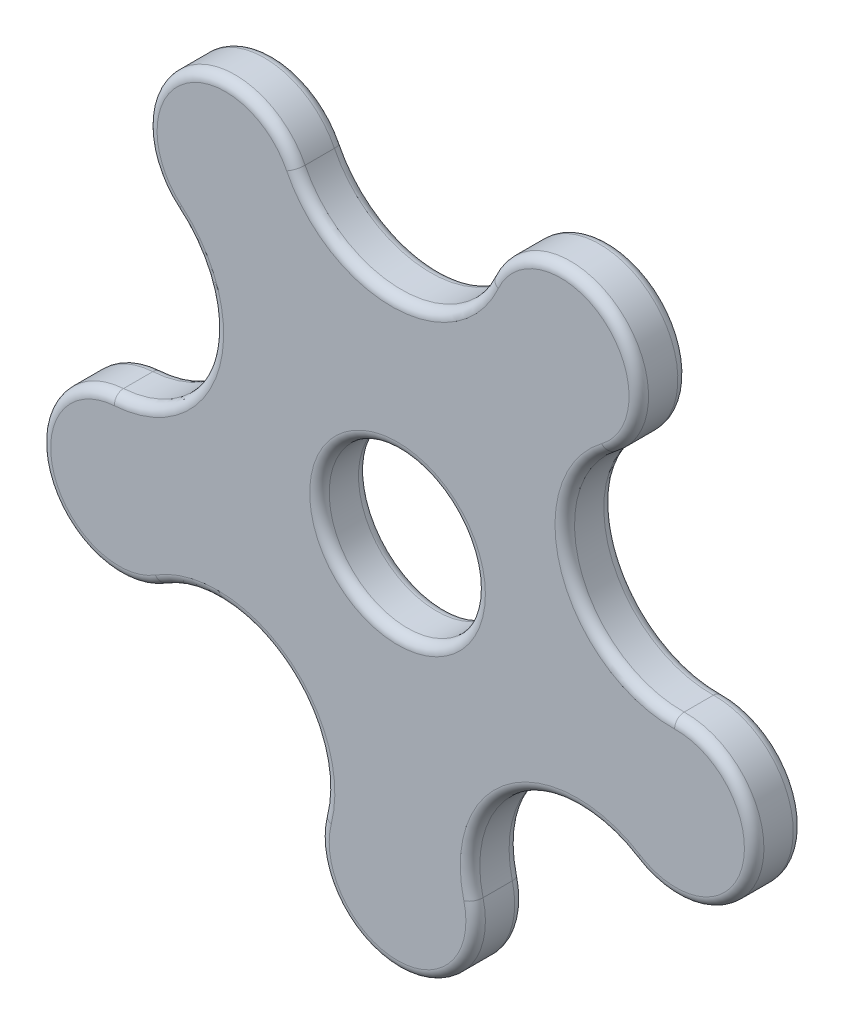
ISO-10303-21;
HEADER;
FILE_DESCRIPTION(('STEP AP214'),'2;1');
FILE_NAME('part.step','',(''),(''),'','','');
FILE_SCHEMA(('AUTOMOTIVE_DESIGN { 1 0 10303 214 1 1 1 1 }'));
ENDSEC;
DATA;
#1=APPLICATION_CONTEXT('core data for automotive mechanical design processes');
#2=APPLICATION_PROTOCOL_DEFINITION('international standard','automotive_design',2000,#1);
#3=PRODUCT_CONTEXT('',#1,'mechanical');
#4=PRODUCT('Part','Part','',(#3));
#5=PRODUCT_RELATED_PRODUCT_CATEGORY('part','',(#4));
#6=PRODUCT_DEFINITION_FORMATION('','',#4);
#7=PRODUCT_DEFINITION_CONTEXT('part definition',#1,'design');
#8=PRODUCT_DEFINITION('design','',#6,#7);
#9=PRODUCT_DEFINITION_SHAPE('','',#8);
#10=(LENGTH_UNIT() NAMED_UNIT(*) SI_UNIT(.MILLI.,.METRE.));
#11=(NAMED_UNIT(*) PLANE_ANGLE_UNIT() SI_UNIT($,.RADIAN.));
#12=(NAMED_UNIT(*) SI_UNIT($,.STERADIAN.) SOLID_ANGLE_UNIT());
#13=UNCERTAINTY_MEASURE_WITH_UNIT(LENGTH_MEASURE(1.E-05),#10,'distance_accuracy_value','');
#14=(GEOMETRIC_REPRESENTATION_CONTEXT(3) GLOBAL_UNCERTAINTY_ASSIGNED_CONTEXT((#13)) GLOBAL_UNIT_ASSIGNED_CONTEXT((#10,
#11,#12)) REPRESENTATION_CONTEXT('',''));
#15=CARTESIAN_POINT('',(0.,0.,0.));
#16=DIRECTION('',(0.,0.,1.));
#17=DIRECTION('',(1.,0.,0.));
#18=AXIS2_PLACEMENT_3D('',#15,#16,#17);
#19=CARTESIAN_POINT('',(8.04949047656189,28.8142522671485,5.));
#20=DIRECTION('',(0.,0.,1.));
#21=DIRECTION('',(1.,0.,0.));
#22=AXIS2_PLACEMENT_3D('',#19,#20,#21);
#23=PLANE('',#22);
#24=CARTESIAN_POINT('',(0.,0.,5.));
#25=DIRECTION('',(0.,0.,1.));
#26=DIRECTION('',(1.,0.,0.));
#27=AXIS2_PLACEMENT_3D('',#24,#25,#26);
#28=CIRCLE('',#27,9.);
#29=CARTESIAN_POINT('',(9.,0.,5.));
#30=VERTEX_POINT('',#29);
#31=EDGE_CURVE('E381',#30,#30,#28,.F.);
#32=ORIENTED_EDGE('',*,*,#31,.T.);
#33=EDGE_LOOP('',(#32));
#34=FACE_BOUND('',#33,.T.);
#35=CARTESIAN_POINT('',(0.,-30.,5.));
#36=DIRECTION('',(0.,0.,1.));
#37=DIRECTION('',(1.,0.,0.));
#38=AXIS2_PLACEMENT_3D('',#35,#36,#37);
#39=CIRCLE('',#38,7.);
#40=CARTESIAN_POINT('',(-6.78797825855479,-28.2902189726788,5.));
#41=VERTEX_POINT('',#40);
#42=CARTESIAN_POINT('',(6.7879782585548,-28.2902189726789,5.));
#43=VERTEX_POINT('',#42);
#44=EDGE_CURVE('E209',#41,#43,#39,.T.);
#45=ORIENTED_EDGE('',*,*,#44,.T.);
#46=CARTESIAN_POINT('',(18.4245124160773,-25.3591657829855,5.));
#47=DIRECTION('',(0.,0.,1.));
#48=DIRECTION('',(1.,0.,0.));
#49=AXIS2_PLACEMENT_3D('',#46,#47,#48);
#50=CIRCLE('',#49,12.);
#51=CARTESIAN_POINT('',(24.8079964620419,-15.1979093924147,5.));
#52=VERTEX_POINT('',#51);
#53=EDGE_CURVE('E188',#43,#52,#50,.F.);
#54=ORIENTED_EDGE('',*,*,#53,.T.);
#55=CARTESIAN_POINT('',(28.5316954888546,-9.27050983124834,5.));
#56=DIRECTION('',(0.,0.,1.));
#57=DIRECTION('',(1.,0.,0.));
#58=AXIS2_PLACEMENT_3D('',#55,#56,#57);
#59=CIRCLE('',#58,7.00000000000007);
#60=CARTESIAN_POINT('',(28.3825142597468,-2.27209965743866,5.));
#61=VERTEX_POINT('',#60);
#62=EDGE_CURVE('E198',#52,#61,#59,.T.);
#63=ORIENTED_EDGE('',*,*,#62,.T.);
#64=CARTESIAN_POINT('',(28.1267750098477,9.72517492623497,5.));
#65=DIRECTION('',(0.,0.,1.));
#66=DIRECTION('',(1.,0.,0.));
#67=AXIS2_PLACEMENT_3D('',#64,#65,#66);
#68=CIRCLE('',#67,12.);
#69=CARTESIAN_POINT('',(20.9174216102417,19.3181527516857,5.));
#70=VERTEX_POINT('',#69);
#71=EDGE_CURVE('E205',#61,#70,#68,.F.);
#72=ORIENTED_EDGE('',*,*,#71,.T.);
#73=CARTESIAN_POINT('',(16.7119654604715,24.9140564831986,5.));
#74=DIRECTION('',(0.,0.,1.));
#75=DIRECTION('',(1.,0.,0.));
#76=AXIS2_PLACEMENT_3D('',#73,#74,#75);
#77=CIRCLE('',#76,7.);
#78=CARTESIAN_POINT('',(10.3290891565381,27.7878849555827,5.));
#79=VERTEX_POINT('',#78);
#80=EDGE_CURVE('E575',#70,#79,#77,.T.);
#81=ORIENTED_EDGE('',*,*,#80,.T.);
#82=CARTESIAN_POINT('',(-0.612984507347689,32.7144480510984,5.));
#83=DIRECTION('',(0.,0.,1.));
#84=DIRECTION('',(1.,0.,0.));
#85=AXIS2_PLACEMENT_3D('',#82,#83,#84);
#86=CIRCLE('',#85,12.);
#87=CARTESIAN_POINT('',(-11.3628201250907,27.3814344385616,5.));
#88=VERTEX_POINT('',#87);
#89=EDGE_CURVE('E578',#79,#88,#86,.F.);
#90=ORIENTED_EDGE('',*,*,#89,.T.);
#91=CARTESIAN_POINT('',(-17.6335575687742,24.2705098312484,5.));
#92=DIRECTION('',(0.,0.,1.));
#93=DIRECTION('',(1.,0.,0.));
#94=AXIS2_PLACEMENT_3D('',#91,#92,#93);
#95=CIRCLE('',#94,7.);
#96=CARTESIAN_POINT('',(-22.1201632648839,18.8973944102253,5.));
#97=VERTEX_POINT('',#96);
#98=EDGE_CURVE('E581',#88,#97,#95,.T.);
#99=ORIENTED_EDGE('',*,*,#98,.T.);
#100=CARTESIAN_POINT('',(-29.8114873153576,9.68633940275719,5.));
#101=DIRECTION('',(0.,0.,1.));
#102=DIRECTION('',(1.,0.,0.));
#103=AXIS2_PLACEMENT_3D('',#100,#101,#102);
#104=CIRCLE('',#103,12.);
#105=CARTESIAN_POINT('',(-29.0031977407242,-2.28640748187789,5.));
#106=VERTEX_POINT('',#105);
#107=EDGE_CURVE('E584',#97,#106,#104,.F.);
#108=ORIENTED_EDGE('',*,*,#107,.T.);
#109=CARTESIAN_POINT('',(-28.5316954888546,-9.27050983124835,5.));
#110=DIRECTION('',(0.,0.,1.));
#111=DIRECTION('',(1.,0.,0.));
#112=AXIS2_PLACEMENT_3D('',#109,#110,#111);
#113=CIRCLE('',#112,7.);
#114=CARTESIAN_POINT('',(-24.8079964620419,-15.1979093924146,5.));
#115=VERTEX_POINT('',#114);
#116=EDGE_CURVE('E587',#106,#115,#113,.T.);
#117=ORIENTED_EDGE('',*,*,#116,.T.);
#118=CARTESIAN_POINT('',(-18.4245124160773,-25.3591657829854,5.));
#119=DIRECTION('',(0.,0.,1.));
#120=DIRECTION('',(1.,0.,0.));
#121=AXIS2_PLACEMENT_3D('',#118,#119,#120);
#122=CIRCLE('',#121,12.);
#123=EDGE_CURVE('E217',#115,#41,#122,.F.);
#124=ORIENTED_EDGE('',*,*,#123,.T.);
#125=EDGE_LOOP('',(#45,#54,#63,#72,#81,#90,#99,#108,#117,#124));
#126=FACE_BOUND('',#125,.T.);
#127=ADVANCED_FACE('F42',(#34,#126),#23,.T.);
#128=CARTESIAN_POINT('',(8.04949047656189,28.8142522671485,0.));
#129=DIRECTION('',(0.,0.,1.));
#130=DIRECTION('',(1.,0.,0.));
#131=AXIS2_PLACEMENT_3D('',#128,#129,#130);
#132=PLANE('',#131);
#133=CARTESIAN_POINT('',(0.,0.,0.));
#134=DIRECTION('',(0.,0.,1.));
#135=DIRECTION('',(1.,0.,0.));
#136=AXIS2_PLACEMENT_3D('',#133,#134,#135);
#137=CIRCLE('',#136,9.);
#138=CARTESIAN_POINT('',(9.,0.,0.));
#139=VERTEX_POINT('',#138);
#140=EDGE_CURVE('E51',#139,#139,#137,.T.);
#141=ORIENTED_EDGE('',*,*,#140,.T.);
#142=EDGE_LOOP('',(#141));
#143=FACE_BOUND('',#142,.T.);
#144=CARTESIAN_POINT('',(28.1267750098477,9.72517492623497,0.));
#145=DIRECTION('',(0.,0.,1.));
#146=DIRECTION('',(1.,0.,0.));
#147=AXIS2_PLACEMENT_3D('',#144,#145,#146);
#148=CIRCLE('',#147,12.);
#149=CARTESIAN_POINT('',(20.9174216102417,19.3181527516857,0.));
#150=VERTEX_POINT('',#149);
#151=CARTESIAN_POINT('',(28.3825142597468,-2.27209965743865,0.));
#152=VERTEX_POINT('',#151);
#153=EDGE_CURVE('E284',#150,#152,#148,.T.);
#154=ORIENTED_EDGE('',*,*,#153,.T.);
#155=CARTESIAN_POINT('',(28.5316954888546,-9.27050983124834,0.));
#156=DIRECTION('',(0.,0.,1.));
#157=DIRECTION('',(1.,0.,0.));
#158=AXIS2_PLACEMENT_3D('',#155,#156,#157);
#159=CIRCLE('',#158,7.00000000000007);
#160=CARTESIAN_POINT('',(24.8079964620419,-15.1979093924147,0.));
#161=VERTEX_POINT('',#160);
#162=EDGE_CURVE('E311',#152,#161,#159,.F.);
#163=ORIENTED_EDGE('',*,*,#162,.T.);
#164=CARTESIAN_POINT('',(18.4245124160773,-25.3591657829855,0.));
#165=DIRECTION('',(0.,0.,1.));
#166=DIRECTION('',(1.,0.,0.));
#167=AXIS2_PLACEMENT_3D('',#164,#165,#166);
#168=CIRCLE('',#167,12.);
#169=CARTESIAN_POINT('',(6.7879782585548,-28.2902189726789,0.));
#170=VERTEX_POINT('',#169);
#171=EDGE_CURVE('E308',#161,#170,#168,.T.);
#172=ORIENTED_EDGE('',*,*,#171,.T.);
#173=CARTESIAN_POINT('',(0.,-30.,0.));
#174=DIRECTION('',(0.,0.,1.));
#175=DIRECTION('',(1.,0.,0.));
#176=AXIS2_PLACEMENT_3D('',#173,#174,#175);
#177=CIRCLE('',#176,7.);
#178=CARTESIAN_POINT('',(-6.78797825855479,-28.2902189726788,0.));
#179=VERTEX_POINT('',#178);
#180=EDGE_CURVE('E305',#170,#179,#177,.F.);
#181=ORIENTED_EDGE('',*,*,#180,.T.);
#182=CARTESIAN_POINT('',(-18.4245124160773,-25.3591657829854,0.));
#183=DIRECTION('',(0.,0.,1.));
#184=DIRECTION('',(1.,0.,0.));
#185=AXIS2_PLACEMENT_3D('',#182,#183,#184);
#186=CIRCLE('',#185,12.);
#187=CARTESIAN_POINT('',(-24.8079964620419,-15.1979093924146,0.));
#188=VERTEX_POINT('',#187);
#189=EDGE_CURVE('E302',#179,#188,#186,.T.);
#190=ORIENTED_EDGE('',*,*,#189,.T.);
#191=CARTESIAN_POINT('',(-28.5316954888546,-9.27050983124835,0.));
#192=DIRECTION('',(0.,0.,1.));
#193=DIRECTION('',(1.,0.,0.));
#194=AXIS2_PLACEMENT_3D('',#191,#192,#193);
#195=CIRCLE('',#194,7.);
#196=CARTESIAN_POINT('',(-29.0031977407242,-2.28640748187789,0.));
#197=VERTEX_POINT('',#196);
#198=EDGE_CURVE('E299',#188,#197,#195,.F.);
#199=ORIENTED_EDGE('',*,*,#198,.T.);
#200=CARTESIAN_POINT('',(-29.8114873153576,9.68633940275719,0.));
#201=DIRECTION('',(0.,0.,1.));
#202=DIRECTION('',(1.,0.,0.));
#203=AXIS2_PLACEMENT_3D('',#200,#201,#202);
#204=CIRCLE('',#203,12.);
#205=CARTESIAN_POINT('',(-22.1201632648839,18.8973944102253,0.));
#206=VERTEX_POINT('',#205);
#207=EDGE_CURVE('E296',#197,#206,#204,.T.);
#208=ORIENTED_EDGE('',*,*,#207,.T.);
#209=CARTESIAN_POINT('',(-17.6335575687742,24.2705098312484,0.));
#210=DIRECTION('',(0.,0.,1.));
#211=DIRECTION('',(1.,0.,0.));
#212=AXIS2_PLACEMENT_3D('',#209,#210,#211);
#213=CIRCLE('',#212,7.);
#214=CARTESIAN_POINT('',(-11.3628201250907,27.3814344385616,0.));
#215=VERTEX_POINT('',#214);
#216=EDGE_CURVE('E293',#206,#215,#213,.F.);
#217=ORIENTED_EDGE('',*,*,#216,.T.);
#218=CARTESIAN_POINT('',(-0.612984507347689,32.7144480510984,0.));
#219=DIRECTION('',(0.,0.,1.));
#220=DIRECTION('',(1.,0.,0.));
#221=AXIS2_PLACEMENT_3D('',#218,#219,#220);
#222=CIRCLE('',#221,12.);
#223=CARTESIAN_POINT('',(10.3290891565381,27.7878849555827,0.));
#224=VERTEX_POINT('',#223);
#225=EDGE_CURVE('E290',#215,#224,#222,.T.);
#226=ORIENTED_EDGE('',*,*,#225,.T.);
#227=CARTESIAN_POINT('',(16.7119654604715,24.9140564831986,0.));
#228=DIRECTION('',(0.,0.,1.));
#229=DIRECTION('',(1.,0.,0.));
#230=AXIS2_PLACEMENT_3D('',#227,#228,#229);
#231=CIRCLE('',#230,7.);
#232=EDGE_CURVE('E287',#224,#150,#231,.F.);
#233=ORIENTED_EDGE('',*,*,#232,.T.);
#234=EDGE_LOOP('',(#154,#163,#172,#181,#190,#199,#208,#217,#226,#233));
#235=FACE_BOUND('',#234,.T.);
#236=ADVANCED_FACE('F388',(#143,#235),#132,.F.);
#237=CARTESIAN_POINT('',(-0.612984507347689,32.7144480510984,5.));
#238=DIRECTION('',(0.,0.,-1.));
#239=DIRECTION('',(-1.,0.,0.));
#240=AXIS2_PLACEMENT_3D('',#237,#238,#239);
#241=CYLINDRICAL_SURFACE('',#240,11.);
#242=DIRECTION('',(0.,0.,-1.));
#243=VECTOR('',#242,1.);
#244=CARTESIAN_POINT('',(9.41724968454762,28.198431880209,5.));
#245=LINE('',#244,#243);
#246=CARTESIAN_POINT('',(9.41724968454762,28.198431880209,4.));
#247=VERTEX_POINT('',#246);
#248=CARTESIAN_POINT('',(9.41724968454762,28.198431880209,1.));
#249=VERTEX_POINT('',#248);
#250=EDGE_CURVE('E280',#247,#249,#245,.T.);
#251=ORIENTED_EDGE('',*,*,#250,.T.);
#252=CARTESIAN_POINT('',(-0.612984507347689,32.7144480510984,1.));
#253=DIRECTION('',(0.,0.,1.));
#254=DIRECTION('',(1.,0.,0.));
#255=AXIS2_PLACEMENT_3D('',#252,#253,#254);
#256=CIRCLE('',#255,11.);
#257=CARTESIAN_POINT('',(-10.4670004902788,27.8258522396063,1.));
#258=VERTEX_POINT('',#257);
#259=EDGE_CURVE('E333',#249,#258,#256,.F.);
#260=ORIENTED_EDGE('',*,*,#259,.T.);
#261=DIRECTION('',(0.,0.,-1.));
#262=VECTOR('',#261,1.);
#263=CARTESIAN_POINT('',(-10.4670004902788,27.8258522396063,5.));
#264=LINE('',#263,#262);
#265=CARTESIAN_POINT('',(-10.4670004902788,27.8258522396063,4.));
#266=VERTEX_POINT('',#265);
#267=EDGE_CURVE('E206',#266,#258,#264,.T.);
#268=ORIENTED_EDGE('',*,*,#267,.F.);
#269=CARTESIAN_POINT('',(-0.612984507347689,32.7144480510984,4.));
#270=DIRECTION('',(0.,0.,1.));
#271=DIRECTION('',(1.,0.,0.));
#272=AXIS2_PLACEMENT_3D('',#269,#270,#271);
#273=CIRCLE('',#272,11.);
#274=EDGE_CURVE('E235',#266,#247,#273,.T.);
#275=ORIENTED_EDGE('',*,*,#274,.T.);
#276=EDGE_LOOP('',(#251,#260,#268,#275));
#277=FACE_BOUND('',#276,.T.);
#278=ADVANCED_FACE('F408',(#277),#241,.F.);
#279=CARTESIAN_POINT('',(-17.6335575687742,24.2705098312484,5.));
#280=DIRECTION('',(0.,0.,-1.));
#281=DIRECTION('',(-1.,0.,0.));
#282=AXIS2_PLACEMENT_3D('',#279,#280,#281);
#283=CYLINDRICAL_SURFACE('',#282,8.);
#284=ORIENTED_EDGE('',*,*,#267,.T.);
#285=CARTESIAN_POINT('',(-17.6335575687742,24.2705098312484,1.));
#286=DIRECTION('',(0.,0.,1.));
#287=DIRECTION('',(1.,0.,0.));
#288=AXIS2_PLACEMENT_3D('',#285,#286,#287);
#289=CIRCLE('',#288,8.);
#290=CARTESIAN_POINT('',(-22.7611069357567,18.1298064929363,1.));
#291=VERTEX_POINT('',#290);
#292=EDGE_CURVE('E330',#258,#291,#289,.T.);
#293=ORIENTED_EDGE('',*,*,#292,.T.);
#294=DIRECTION('',(0.,0.,-1.));
#295=VECTOR('',#294,1.);
#296=CARTESIAN_POINT('',(-22.7611069357567,18.1298064929363,5.));
#297=LINE('',#296,#295);
#298=CARTESIAN_POINT('',(-22.7611069357567,18.1298064929363,4.));
#299=VERTEX_POINT('',#298);
#300=EDGE_CURVE('E566',#299,#291,#297,.T.);
#301=ORIENTED_EDGE('',*,*,#300,.F.);
#302=CARTESIAN_POINT('',(-17.6335575687742,24.2705098312484,4.));
#303=DIRECTION('',(0.,0.,1.));
#304=DIRECTION('',(1.,0.,0.));
#305=AXIS2_PLACEMENT_3D('',#302,#303,#304);
#306=CIRCLE('',#305,8.);
#307=EDGE_CURVE('E232',#299,#266,#306,.F.);
#308=ORIENTED_EDGE('',*,*,#307,.T.);
#309=EDGE_LOOP('',(#284,#293,#301,#308));
#310=FACE_BOUND('',#309,.T.);
#311=ADVANCED_FACE('F442',(#310),#283,.T.);
#312=CARTESIAN_POINT('',(-29.8114873153576,9.68633940275719,5.));
#313=DIRECTION('',(0.,0.,-1.));
#314=DIRECTION('',(-1.,0.,0.));
#315=AXIS2_PLACEMENT_3D('',#312,#313,#314);
#316=CYLINDRICAL_SURFACE('',#315,11.);
#317=ORIENTED_EDGE('',*,*,#300,.T.);
#318=CARTESIAN_POINT('',(-29.8114873153576,9.68633940275719,1.));
#319=DIRECTION('',(0.,0.,1.));
#320=DIRECTION('',(1.,0.,0.));
#321=AXIS2_PLACEMENT_3D('',#318,#319,#320);
#322=CIRCLE('',#321,11.);
#323=CARTESIAN_POINT('',(-29.0705552052769,-1.28867857482496,1.));
#324=VERTEX_POINT('',#323);
#325=EDGE_CURVE('E327',#291,#324,#322,.F.);
#326=ORIENTED_EDGE('',*,*,#325,.T.);
#327=DIRECTION('',(0.,0.,-1.));
#328=VECTOR('',#327,1.);
#329=CARTESIAN_POINT('',(-29.0705552052769,-1.28867857482496,5.));
#330=LINE('',#329,#328);
#331=CARTESIAN_POINT('',(-29.0705552052769,-1.28867857482496,4.));
#332=VERTEX_POINT('',#331);
#333=EDGE_CURVE('E557',#332,#324,#330,.T.);
#334=ORIENTED_EDGE('',*,*,#333,.F.);
#335=CARTESIAN_POINT('',(-29.8114873153576,9.68633940275719,4.));
#336=DIRECTION('',(0.,0.,1.));
#337=DIRECTION('',(1.,0.,0.));
#338=AXIS2_PLACEMENT_3D('',#335,#336,#337);
#339=CIRCLE('',#338,11.);
#340=EDGE_CURVE('E229',#332,#299,#339,.T.);
#341=ORIENTED_EDGE('',*,*,#340,.T.);
#342=EDGE_LOOP('',(#317,#326,#334,#341));
#343=FACE_BOUND('',#342,.T.);
#344=ADVANCED_FACE('F438',(#343),#316,.F.);
#345=CARTESIAN_POINT('',(-28.5316954888546,-9.27050983124835,5.));
#346=DIRECTION('',(0.,0.,-1.));
#347=DIRECTION('',(-1.,0.,0.));
#348=AXIS2_PLACEMENT_3D('',#345,#346,#347);
#349=CYLINDRICAL_SURFACE('',#348,8.);
#350=ORIENTED_EDGE('',*,*,#333,.T.);
#351=CARTESIAN_POINT('',(-28.5316954888546,-9.27050983124835,1.));
#352=DIRECTION('',(0.,0.,1.));
#353=DIRECTION('',(1.,0.,0.));
#354=AXIS2_PLACEMENT_3D('',#351,#352,#353);
#355=CIRCLE('',#354,8.);
#356=CARTESIAN_POINT('',(-24.2760394582115,-16.0446807582955,1.));
#357=VERTEX_POINT('',#356);
#358=EDGE_CURVE('E324',#324,#357,#355,.T.);
#359=ORIENTED_EDGE('',*,*,#358,.T.);
#360=DIRECTION('',(0.,0.,-1.));
#361=VECTOR('',#360,1.);
#362=CARTESIAN_POINT('',(-24.2760394582115,-16.0446807582955,5.));
#363=LINE('',#362,#361);
#364=CARTESIAN_POINT('',(-24.2760394582115,-16.0446807582955,4.));
#365=VERTEX_POINT('',#364);
#366=EDGE_CURVE('E548',#365,#357,#363,.T.);
#367=ORIENTED_EDGE('',*,*,#366,.F.);
#368=CARTESIAN_POINT('',(-28.5316954888546,-9.27050983124835,4.));
#369=DIRECTION('',(0.,0.,1.));
#370=DIRECTION('',(1.,0.,0.));
#371=AXIS2_PLACEMENT_3D('',#368,#369,#370);
#372=CIRCLE('',#371,8.);
#373=EDGE_CURVE('E226',#365,#332,#372,.F.);
#374=ORIENTED_EDGE('',*,*,#373,.T.);
#375=EDGE_LOOP('',(#350,#359,#367,#374));
#376=FACE_BOUND('',#375,.T.);
#377=ADVANCED_FACE('F434',(#376),#349,.T.);
#378=CARTESIAN_POINT('',(-18.4245124160773,-25.3591657829854,5.));
#379=DIRECTION('',(0.,0.,-1.));
#380=DIRECTION('',(-1.,0.,0.));
#381=AXIS2_PLACEMENT_3D('',#378,#379,#380);
#382=CYLINDRICAL_SURFACE('',#381,11.);
#383=ORIENTED_EDGE('',*,*,#366,.T.);
#384=CARTESIAN_POINT('',(-18.4245124160773,-25.3591657829854,1.));
#385=DIRECTION('',(0.,0.,1.));
#386=DIRECTION('',(1.,0.,0.));
#387=AXIS2_PLACEMENT_3D('',#384,#385,#386);
#388=CIRCLE('',#387,11.);
#389=CARTESIAN_POINT('',(-7.75768943834833,-28.0459645402044,1.));
#390=VERTEX_POINT('',#389);
#391=EDGE_CURVE('E321',#357,#390,#388,.F.);
#392=ORIENTED_EDGE('',*,*,#391,.T.);
#393=DIRECTION('',(0.,0.,-1.));
#394=VECTOR('',#393,1.);
#395=CARTESIAN_POINT('',(-7.75768943834833,-28.0459645402044,5.));
#396=LINE('',#395,#394);
#397=CARTESIAN_POINT('',(-7.75768943834833,-28.0459645402044,4.));
#398=VERTEX_POINT('',#397);
#399=EDGE_CURVE('E545',#398,#390,#396,.T.);
#400=ORIENTED_EDGE('',*,*,#399,.F.);
#401=CARTESIAN_POINT('',(-18.4245124160773,-25.3591657829854,4.));
#402=DIRECTION('',(0.,0.,1.));
#403=DIRECTION('',(1.,0.,0.));
#404=AXIS2_PLACEMENT_3D('',#401,#402,#403);
#405=CIRCLE('',#404,11.);
#406=EDGE_CURVE('E223',#398,#365,#405,.T.);
#407=ORIENTED_EDGE('',*,*,#406,.T.);
#408=EDGE_LOOP('',(#383,#392,#400,#407));
#409=FACE_BOUND('',#408,.T.);
#410=ADVANCED_FACE('F430',(#409),#382,.F.);
#411=CARTESIAN_POINT('',(0.,-30.,5.));
#412=DIRECTION('',(0.,0.,-1.));
#413=DIRECTION('',(-1.,0.,0.));
#414=AXIS2_PLACEMENT_3D('',#411,#412,#413);
#415=CYLINDRICAL_SURFACE('',#414,8.);
#416=ORIENTED_EDGE('',*,*,#399,.T.);
#417=CARTESIAN_POINT('',(0.,-30.,1.));
#418=DIRECTION('',(0.,0.,1.));
#419=DIRECTION('',(1.,0.,0.));
#420=AXIS2_PLACEMENT_3D('',#417,#418,#419);
#421=CIRCLE('',#420,8.);
#422=CARTESIAN_POINT('',(7.75768943834835,-28.0459645402044,1.));
#423=VERTEX_POINT('',#422);
#424=EDGE_CURVE('E318',#390,#423,#421,.T.);
#425=ORIENTED_EDGE('',*,*,#424,.T.);
#426=DIRECTION('',(0.,0.,-1.));
#427=VECTOR('',#426,1.);
#428=CARTESIAN_POINT('',(7.75768943834835,-28.0459645402044,5.));
#429=LINE('',#428,#427);
#430=CARTESIAN_POINT('',(7.75768943834835,-28.0459645402044,4.));
#431=VERTEX_POINT('',#430);
#432=EDGE_CURVE('E553',#431,#423,#429,.T.);
#433=ORIENTED_EDGE('',*,*,#432,.F.);
#434=CARTESIAN_POINT('',(0.,-30.,4.));
#435=DIRECTION('',(0.,0.,1.));
#436=DIRECTION('',(1.,0.,0.));
#437=AXIS2_PLACEMENT_3D('',#434,#435,#436);
#438=CIRCLE('',#437,8.);
#439=EDGE_CURVE('E215',#431,#398,#438,.F.);
#440=ORIENTED_EDGE('',*,*,#439,.T.);
#441=EDGE_LOOP('',(#416,#425,#433,#440));
#442=FACE_BOUND('',#441,.T.);
#443=ADVANCED_FACE('F426',(#442),#415,.T.);
#444=CARTESIAN_POINT('',(18.4245124160773,-25.3591657829855,5.));
#445=DIRECTION('',(0.,0.,-1.));
#446=DIRECTION('',(-1.,0.,0.));
#447=AXIS2_PLACEMENT_3D('',#444,#445,#446);
#448=CYLINDRICAL_SURFACE('',#447,11.);
#449=ORIENTED_EDGE('',*,*,#432,.T.);
#450=CARTESIAN_POINT('',(18.4245124160773,-25.3591657829855,1.));
#451=DIRECTION('',(0.,0.,1.));
#452=DIRECTION('',(1.,0.,0.));
#453=AXIS2_PLACEMENT_3D('',#450,#451,#452);
#454=CIRCLE('',#453,11.);
#455=CARTESIAN_POINT('',(24.2760394582115,-16.0446807582956,1.));
#456=VERTEX_POINT('',#455);
#457=EDGE_CURVE('E315',#423,#456,#454,.F.);
#458=ORIENTED_EDGE('',*,*,#457,.T.);
#459=DIRECTION('',(0.,0.,-1.));
#460=VECTOR('',#459,1.);
#461=CARTESIAN_POINT('',(24.2760394582115,-16.0446807582956,5.));
#462=LINE('',#461,#460);
#463=CARTESIAN_POINT('',(24.2760394582115,-16.0446807582956,4.));
#464=VERTEX_POINT('',#463);
#465=EDGE_CURVE('E559',#464,#456,#462,.T.);
#466=ORIENTED_EDGE('',*,*,#465,.F.);
#467=CARTESIAN_POINT('',(18.4245124160773,-25.3591657829855,4.));
#468=DIRECTION('',(0.,0.,1.));
#469=DIRECTION('',(1.,0.,0.));
#470=AXIS2_PLACEMENT_3D('',#467,#468,#469);
#471=CIRCLE('',#470,11.);
#472=EDGE_CURVE('E190',#464,#431,#471,.T.);
#473=ORIENTED_EDGE('',*,*,#472,.T.);
#474=EDGE_LOOP('',(#449,#458,#466,#473));
#475=FACE_BOUND('',#474,.T.);
#476=ADVANCED_FACE('F422',(#475),#448,.F.);
#477=CARTESIAN_POINT('',(28.5316954888546,-9.27050983124834,5.));
#478=DIRECTION('',(0.,0.,-1.));
#479=DIRECTION('',(-1.,0.,0.));
#480=AXIS2_PLACEMENT_3D('',#477,#478,#479);
#481=CYLINDRICAL_SURFACE('',#480,8.00000000000007);
#482=ORIENTED_EDGE('',*,*,#465,.T.);
#483=CARTESIAN_POINT('',(28.5316954888546,-9.27050983124834,1.));
#484=DIRECTION('',(0.,0.,1.));
#485=DIRECTION('',(1.,0.,0.));
#486=AXIS2_PLACEMENT_3D('',#483,#484,#485);
#487=CIRCLE('',#486,8.00000000000007);
#488=CARTESIAN_POINT('',(28.3612026555886,-1.27232677546585,1.));
#489=VERTEX_POINT('',#488);
#490=EDGE_CURVE('E246',#456,#489,#487,.T.);
#491=ORIENTED_EDGE('',*,*,#490,.T.);
#492=DIRECTION('',(0.,0.,-1.));
#493=VECTOR('',#492,1.);
#494=CARTESIAN_POINT('',(28.3612026555886,-1.27232677546585,5.));
#495=LINE('',#494,#493);
#496=CARTESIAN_POINT('',(28.3612026555886,-1.27232677546585,4.));
#497=VERTEX_POINT('',#496);
#498=EDGE_CURVE('E600',#497,#489,#495,.T.);
#499=ORIENTED_EDGE('',*,*,#498,.F.);
#500=CARTESIAN_POINT('',(28.5316954888546,-9.27050983124834,4.));
#501=DIRECTION('',(0.,0.,1.));
#502=DIRECTION('',(1.,0.,0.));
#503=AXIS2_PLACEMENT_3D('',#500,#501,#502);
#504=CIRCLE('',#503,8.00000000000007);
#505=EDGE_CURVE('E244',#497,#464,#504,.F.);
#506=ORIENTED_EDGE('',*,*,#505,.T.);
#507=EDGE_LOOP('',(#482,#491,#499,#506));
#508=FACE_BOUND('',#507,.T.);
#509=ADVANCED_FACE('F419',(#508),#481,.T.);
#510=CARTESIAN_POINT('',(28.1267750098477,9.72517492623497,5.));
#511=DIRECTION('',(0.,0.,-1.));
#512=DIRECTION('',(-1.,0.,0.));
#513=AXIS2_PLACEMENT_3D('',#510,#511,#512);
#514=CYLINDRICAL_SURFACE('',#513,11.);
#515=ORIENTED_EDGE('',*,*,#498,.T.);
#516=CARTESIAN_POINT('',(28.1267750098477,9.72517492623497,1.));
#517=DIRECTION('',(0.,0.,1.));
#518=DIRECTION('',(1.,0.,0.));
#519=AXIS2_PLACEMENT_3D('',#516,#517,#518);
#520=CIRCLE('',#519,11.);
#521=CARTESIAN_POINT('',(21.5182010602089,18.5187379328981,1.));
#522=VERTEX_POINT('',#521);
#523=EDGE_CURVE('E58',#489,#522,#520,.F.);
#524=ORIENTED_EDGE('',*,*,#523,.T.);
#525=DIRECTION('',(0.,0.,-1.));
#526=VECTOR('',#525,1.);
#527=CARTESIAN_POINT('',(21.5182010602089,18.5187379328981,5.));
#528=LINE('',#527,#526);
#529=CARTESIAN_POINT('',(21.5182010602089,18.5187379328981,4.));
#530=VERTEX_POINT('',#529);
#531=EDGE_CURVE('E602',#530,#522,#528,.T.);
#532=ORIENTED_EDGE('',*,*,#531,.F.);
#533=CARTESIAN_POINT('',(28.1267750098477,9.72517492623497,4.));
#534=DIRECTION('',(0.,0.,1.));
#535=DIRECTION('',(1.,0.,0.));
#536=AXIS2_PLACEMENT_3D('',#533,#534,#535);
#537=CIRCLE('',#536,11.);
#538=EDGE_CURVE('E241',#530,#497,#537,.T.);
#539=ORIENTED_EDGE('',*,*,#538,.T.);
#540=EDGE_LOOP('',(#515,#524,#532,#539));
#541=FACE_BOUND('',#540,.T.);
#542=ADVANCED_FACE('F416',(#541),#514,.F.);
#543=CARTESIAN_POINT('',(16.7119654604715,24.9140564831986,5.));
#544=DIRECTION('',(0.,0.,-1.));
#545=DIRECTION('',(-1.,0.,0.));
#546=AXIS2_PLACEMENT_3D('',#543,#544,#545);
#547=CYLINDRICAL_SURFACE('',#546,8.);
#548=ORIENTED_EDGE('',*,*,#531,.T.);
#549=CARTESIAN_POINT('',(16.7119654604715,24.9140564831986,1.));
#550=DIRECTION('',(0.,0.,1.));
#551=DIRECTION('',(1.,0.,0.));
#552=AXIS2_PLACEMENT_3D('',#549,#550,#551);
#553=CIRCLE('',#552,8.);
#554=EDGE_CURVE('E65',#522,#249,#553,.T.);
#555=ORIENTED_EDGE('',*,*,#554,.T.);
#556=ORIENTED_EDGE('',*,*,#250,.F.);
#557=CARTESIAN_POINT('',(16.7119654604715,24.9140564831986,4.));
#558=DIRECTION('',(0.,0.,1.));
#559=DIRECTION('',(1.,0.,0.));
#560=AXIS2_PLACEMENT_3D('',#557,#558,#559);
#561=CIRCLE('',#560,8.);
#562=EDGE_CURVE('E238',#247,#530,#561,.F.);
#563=ORIENTED_EDGE('',*,*,#562,.T.);
#564=EDGE_LOOP('',(#548,#555,#556,#563));
#565=FACE_BOUND('',#564,.T.);
#566=ADVANCED_FACE('F413',(#565),#547,.T.);
#567=CARTESIAN_POINT('',(0.,0.,5.));
#568=DIRECTION('',(0.,0.,-1.));
#569=DIRECTION('',(-1.,0.,0.));
#570=AXIS2_PLACEMENT_3D('',#567,#568,#569);
#571=CYLINDRICAL_SURFACE('',#570,8.);
#572=CARTESIAN_POINT('',(0.,0.,1.));
#573=DIRECTION('',(0.,0.,1.));
#574=DIRECTION('',(1.,0.,0.));
#575=AXIS2_PLACEMENT_3D('',#572,#573,#574);
#576=CIRCLE('',#575,8.);
#577=CARTESIAN_POINT('',(8.,0.,1.));
#578=VERTEX_POINT('',#577);
#579=EDGE_CURVE('E11',#578,#578,#576,.F.);
#580=ORIENTED_EDGE('',*,*,#579,.T.);
#581=EDGE_LOOP('',(#580));
#582=FACE_BOUND('',#581,.T.);
#583=CARTESIAN_POINT('',(0.,0.,4.));
#584=DIRECTION('',(0.,0.,1.));
#585=DIRECTION('',(1.,0.,0.));
#586=AXIS2_PLACEMENT_3D('',#583,#584,#585);
#587=CIRCLE('',#586,8.);
#588=CARTESIAN_POINT('',(8.,0.,4.));
#589=VERTEX_POINT('',#588);
#590=EDGE_CURVE('E340',#589,#589,#587,.T.);
#591=ORIENTED_EDGE('',*,*,#590,.T.);
#592=EDGE_LOOP('',(#591));
#593=FACE_BOUND('',#592,.T.);
#594=ADVANCED_FACE('F411',(#582,#593),#571,.F.);
#595=CARTESIAN_POINT('',(-17.6335575687742,24.2705098312484,4.));
#596=DIRECTION('',(0.,0.,1.));
#597=DIRECTION('',(1.,0.,0.));
#598=AXIS2_PLACEMENT_3D('',#595,#596,#597);
#599=TOROIDAL_SURFACE('',#598,7.,1.);
#600=CARTESIAN_POINT('',(-11.3628201250907,27.3814344385616,4.));
#601=DIRECTION('',(0.444417801044733,-0.895819634811921,0.));
#602=DIRECTION('',(0.895819634811921,0.444417801044733,0.));
#603=AXIS2_PLACEMENT_3D('',#600,#601,#602);
#604=CIRCLE('',#603,1.);
#605=EDGE_CURVE('E272',#266,#88,#604,.T.);
#606=ORIENTED_EDGE('',*,*,#605,.F.);
#607=ORIENTED_EDGE('',*,*,#307,.F.);
#608=CARTESIAN_POINT('',(-22.1201632648839,18.8973944102253,4.));
#609=DIRECTION('',(0.767587917289012,-0.640943670872813,0.));
#610=DIRECTION('',(0.640943670872813,0.767587917289012,0.));
#611=AXIS2_PLACEMENT_3D('',#608,#609,#610);
#612=CIRCLE('',#611,1.);
#613=EDGE_CURVE('E276',#97,#299,#612,.T.);
#614=ORIENTED_EDGE('',*,*,#613,.F.);
#615=ORIENTED_EDGE('',*,*,#98,.F.);
#616=EDGE_LOOP('',(#606,#607,#614,#615));
#617=FACE_BOUND('',#616,.T.);
#618=ADVANCED_FACE('F482',(#617),#599,.T.);
#619=CARTESIAN_POINT('',(-29.8114873153576,9.68633940275719,4.));
#620=DIRECTION('',(0.,0.,1.));
#621=DIRECTION('',(1.,0.,0.));
#622=AXIS2_PLACEMENT_3D('',#619,#620,#621);
#623=TOROIDAL_SURFACE('',#622,12.,1.);
#624=ORIENTED_EDGE('',*,*,#613,.T.);
#625=ORIENTED_EDGE('',*,*,#340,.F.);
#626=CARTESIAN_POINT('',(-29.0031977407242,-2.28640748187789,4.));
#627=DIRECTION('',(-0.997728907052923,-0.067357464552789,0.));
#628=DIRECTION('',(0.067357464552789,-0.997728907052923,0.));
#629=AXIS2_PLACEMENT_3D('',#626,#627,#628);
#630=CIRCLE('',#629,1.);
#631=EDGE_CURVE('E268',#106,#332,#630,.T.);
#632=ORIENTED_EDGE('',*,*,#631,.F.);
#633=ORIENTED_EDGE('',*,*,#107,.F.);
#634=EDGE_LOOP('',(#624,#625,#632,#633));
#635=FACE_BOUND('',#634,.T.);
#636=ADVANCED_FACE('F478',(#635),#623,.T.);
#637=CARTESIAN_POINT('',(-0.612984507347689,32.7144480510984,4.));
#638=DIRECTION('',(0.,0.,1.));
#639=DIRECTION('',(1.,0.,0.));
#640=AXIS2_PLACEMENT_3D('',#637,#638,#639);
#641=TOROIDAL_SURFACE('',#640,12.,1.);
#642=ORIENTED_EDGE('',*,*,#605,.T.);
#643=ORIENTED_EDGE('',*,*,#89,.F.);
#644=CARTESIAN_POINT('',(10.3290891565381,27.7878849555827,4.));
#645=DIRECTION('',(0.410546924626304,0.911839471990484,0.));
#646=DIRECTION('',(-0.911839471990484,0.410546924626304,0.));
#647=AXIS2_PLACEMENT_3D('',#644,#645,#646);
#648=CIRCLE('',#647,1.);
#649=EDGE_CURVE('E264',#247,#79,#648,.T.);
#650=ORIENTED_EDGE('',*,*,#649,.F.);
#651=ORIENTED_EDGE('',*,*,#274,.F.);
#652=EDGE_LOOP('',(#642,#643,#650,#651));
#653=FACE_BOUND('',#652,.T.);
#654=ADVANCED_FACE('F474',(#653),#641,.T.);
#655=CARTESIAN_POINT('',(-28.5316954888546,-9.27050983124835,4.));
#656=DIRECTION('',(0.,0.,1.));
#657=DIRECTION('',(1.,0.,0.));
#658=AXIS2_PLACEMENT_3D('',#655,#656,#657);
#659=TOROIDAL_SURFACE('',#658,7.,1.);
#660=ORIENTED_EDGE('',*,*,#631,.T.);
#661=ORIENTED_EDGE('',*,*,#373,.F.);
#662=CARTESIAN_POINT('',(-24.8079964620419,-15.1979093924146,4.));
#663=DIRECTION('',(0.846771365880896,0.531957003830387,0.));
#664=DIRECTION('',(-0.531957003830387,0.846771365880896,0.));
#665=AXIS2_PLACEMENT_3D('',#662,#663,#664);
#666=CIRCLE('',#665,1.);
#667=EDGE_CURVE('E260',#115,#365,#666,.T.);
#668=ORIENTED_EDGE('',*,*,#667,.F.);
#669=ORIENTED_EDGE('',*,*,#116,.F.);
#670=EDGE_LOOP('',(#660,#661,#668,#669));
#671=FACE_BOUND('',#670,.T.);
#672=ADVANCED_FACE('F470',(#671),#659,.T.);
#673=CARTESIAN_POINT('',(16.7119654604715,24.9140564831986,4.));
#674=DIRECTION('',(0.,0.,1.));
#675=DIRECTION('',(1.,0.,0.));
#676=AXIS2_PLACEMENT_3D('',#673,#674,#675);
#677=TOROIDAL_SURFACE('',#676,7.,1.);
#678=ORIENTED_EDGE('',*,*,#649,.T.);
#679=ORIENTED_EDGE('',*,*,#80,.F.);
#680=CARTESIAN_POINT('',(20.9174216102417,19.3181527516857,4.));
#681=DIRECTION('',(-0.799414818787556,-0.600779449967173,0.));
#682=DIRECTION('',(0.600779449967173,-0.799414818787556,0.));
#683=AXIS2_PLACEMENT_3D('',#680,#681,#682);
#684=CIRCLE('',#683,1.);
#685=EDGE_CURVE('E256',#530,#70,#684,.T.);
#686=ORIENTED_EDGE('',*,*,#685,.F.);
#687=ORIENTED_EDGE('',*,*,#562,.F.);
#688=EDGE_LOOP('',(#678,#679,#686,#687));
#689=FACE_BOUND('',#688,.T.);
#690=ADVANCED_FACE('F466',(#689),#677,.T.);
#691=CARTESIAN_POINT('',(-18.4245124160773,-25.3591657829854,4.));
#692=DIRECTION('',(0.,0.,1.));
#693=DIRECTION('',(1.,0.,0.));
#694=AXIS2_PLACEMENT_3D('',#691,#692,#693);
#695=TOROIDAL_SURFACE('',#694,12.,1.);
#696=ORIENTED_EDGE('',*,*,#667,.T.);
#697=ORIENTED_EDGE('',*,*,#406,.F.);
#698=CARTESIAN_POINT('',(-6.78797825855479,-28.2902189726788,4.));
#699=DIRECTION('',(-0.244254432474455,-0.969711179793541,0.));
#700=DIRECTION('',(0.969711179793542,-0.244254432474455,0.));
#701=AXIS2_PLACEMENT_3D('',#698,#699,#700);
#702=CIRCLE('',#701,1.);
#703=EDGE_CURVE('E252',#41,#398,#702,.T.);
#704=ORIENTED_EDGE('',*,*,#703,.F.);
#705=ORIENTED_EDGE('',*,*,#123,.F.);
#706=EDGE_LOOP('',(#696,#697,#704,#705));
#707=FACE_BOUND('',#706,.T.);
#708=ADVANCED_FACE('F462',(#707),#695,.T.);
#709=CARTESIAN_POINT('',(28.1267750098477,9.72517492623497,4.));
#710=DIRECTION('',(0.,0.,1.));
#711=DIRECTION('',(1.,0.,0.));
#712=AXIS2_PLACEMENT_3D('',#709,#710,#711);
#713=TOROIDAL_SURFACE('',#712,12.,1.);
#714=ORIENTED_EDGE('',*,*,#685,.T.);
#715=ORIENTED_EDGE('',*,*,#71,.F.);
#716=CARTESIAN_POINT('',(28.3825142597468,-2.27209965743866,4.));
#717=DIRECTION('',(0.999772881972802,0.0213116041582577,0.));
#718=DIRECTION('',(-0.0213116041582577,0.999772881972802,0.));
#719=AXIS2_PLACEMENT_3D('',#716,#717,#718);
#720=CIRCLE('',#719,1.);
#721=EDGE_CURVE('E201',#497,#61,#720,.T.);
#722=ORIENTED_EDGE('',*,*,#721,.F.);
#723=ORIENTED_EDGE('',*,*,#538,.F.);
#724=EDGE_LOOP('',(#714,#715,#722,#723));
#725=FACE_BOUND('',#724,.T.);
#726=ADVANCED_FACE('F458',(#725),#713,.T.);
#727=CARTESIAN_POINT('',(0.,-30.,4.));
#728=DIRECTION('',(0.,0.,1.));
#729=DIRECTION('',(1.,0.,0.));
#730=AXIS2_PLACEMENT_3D('',#727,#728,#729);
#731=TOROIDAL_SURFACE('',#730,7.,1.);
#732=ORIENTED_EDGE('',*,*,#703,.T.);
#733=ORIENTED_EDGE('',*,*,#439,.F.);
#734=CARTESIAN_POINT('',(6.7879782585548,-28.2902189726789,4.));
#735=DIRECTION('',(-0.244254432474448,0.969711179793543,0.));
#736=DIRECTION('',(-0.969711179793543,-0.244254432474448,0.));
#737=AXIS2_PLACEMENT_3D('',#734,#735,#736);
#738=CIRCLE('',#737,1.);
#739=EDGE_CURVE('E194',#43,#431,#738,.T.);
#740=ORIENTED_EDGE('',*,*,#739,.F.);
#741=ORIENTED_EDGE('',*,*,#44,.F.);
#742=EDGE_LOOP('',(#732,#733,#740,#741));
#743=FACE_BOUND('',#742,.T.);
#744=ADVANCED_FACE('F455',(#743),#731,.T.);
#745=CARTESIAN_POINT('',(28.5316954888546,-9.27050983124834,4.));
#746=DIRECTION('',(0.,0.,1.));
#747=DIRECTION('',(1.,0.,0.));
#748=AXIS2_PLACEMENT_3D('',#745,#746,#747);
#749=TOROIDAL_SURFACE('',#748,7.00000000000007,1.);
#750=ORIENTED_EDGE('',*,*,#721,.T.);
#751=ORIENTED_EDGE('',*,*,#62,.F.);
#752=CARTESIAN_POINT('',(24.8079964620419,-15.1979093924147,4.));
#753=DIRECTION('',(-0.846771365880898,0.531957003830383,0.));
#754=DIRECTION('',(-0.531957003830383,-0.846771365880898,0.));
#755=AXIS2_PLACEMENT_3D('',#752,#753,#754);
#756=CIRCLE('',#755,1.);
#757=EDGE_CURVE('E184',#464,#52,#756,.T.);
#758=ORIENTED_EDGE('',*,*,#757,.F.);
#759=ORIENTED_EDGE('',*,*,#505,.F.);
#760=EDGE_LOOP('',(#750,#751,#758,#759));
#761=FACE_BOUND('',#760,.T.);
#762=ADVANCED_FACE('F199',(#761),#749,.T.);
#763=CARTESIAN_POINT('',(18.4245124160773,-25.3591657829855,4.));
#764=DIRECTION('',(0.,0.,1.));
#765=DIRECTION('',(1.,0.,0.));
#766=AXIS2_PLACEMENT_3D('',#763,#764,#765);
#767=TOROIDAL_SURFACE('',#766,12.,1.);
#768=ORIENTED_EDGE('',*,*,#739,.T.);
#769=ORIENTED_EDGE('',*,*,#472,.F.);
#770=ORIENTED_EDGE('',*,*,#757,.T.);
#771=ORIENTED_EDGE('',*,*,#53,.F.);
#772=EDGE_LOOP('',(#768,#769,#770,#771));
#773=FACE_BOUND('',#772,.T.);
#774=ADVANCED_FACE('F186',(#773),#767,.T.);
#775=CARTESIAN_POINT('',(-29.8114873153576,9.68633940275719,1.));
#776=DIRECTION('',(0.,0.,1.));
#777=DIRECTION('',(1.,0.,0.));
#778=AXIS2_PLACEMENT_3D('',#775,#776,#777);
#779=TOROIDAL_SURFACE('',#778,12.,1.);
#780=CARTESIAN_POINT('',(-22.1201632648839,18.8973944102253,1.));
#781=DIRECTION('',(-0.767587917289012,0.640943670872813,0.));
#782=DIRECTION('',(-0.640943670872813,-0.767587917289012,0.));
#783=AXIS2_PLACEMENT_3D('',#780,#781,#782);
#784=CIRCLE('',#783,1.);
#785=EDGE_CURVE('E371',#206,#291,#784,.T.);
#786=ORIENTED_EDGE('',*,*,#785,.F.);
#787=ORIENTED_EDGE('',*,*,#207,.F.);
#788=CARTESIAN_POINT('',(-29.0031977407242,-2.28640748187788,1.));
#789=DIRECTION('',(-0.997728907052923,-0.0673574645527891,0.));
#790=DIRECTION('',(0.0673574645527891,-0.997728907052923,0.));
#791=AXIS2_PLACEMENT_3D('',#788,#789,#790);
#792=CIRCLE('',#791,1.);
#793=EDGE_CURVE('E195',#324,#197,#792,.T.);
#794=ORIENTED_EDGE('',*,*,#793,.F.);
#795=ORIENTED_EDGE('',*,*,#325,.F.);
#796=EDGE_LOOP('',(#786,#787,#794,#795));
#797=FACE_BOUND('',#796,.T.);
#798=ADVANCED_FACE('F452',(#797),#779,.T.);
#799=CARTESIAN_POINT('',(-28.5316954888546,-9.27050983124835,1.));
#800=DIRECTION('',(0.,0.,1.));
#801=DIRECTION('',(1.,0.,0.));
#802=AXIS2_PLACEMENT_3D('',#799,#800,#801);
#803=TOROIDAL_SURFACE('',#802,7.,1.);
#804=ORIENTED_EDGE('',*,*,#793,.T.);
#805=ORIENTED_EDGE('',*,*,#198,.F.);
#806=CARTESIAN_POINT('',(-24.8079964620419,-15.1979093924146,1.));
#807=DIRECTION('',(0.846771365880896,0.531957003830387,0.));
#808=DIRECTION('',(-0.531957003830387,0.846771365880896,0.));
#809=AXIS2_PLACEMENT_3D('',#806,#807,#808);
#810=CIRCLE('',#809,1.);
#811=EDGE_CURVE('E367',#357,#188,#810,.T.);
#812=ORIENTED_EDGE('',*,*,#811,.F.);
#813=ORIENTED_EDGE('',*,*,#358,.F.);
#814=EDGE_LOOP('',(#804,#805,#812,#813));
#815=FACE_BOUND('',#814,.T.);
#816=ADVANCED_FACE('F517',(#815),#803,.T.);
#817=CARTESIAN_POINT('',(-17.6335575687742,24.2705098312484,1.));
#818=DIRECTION('',(0.,0.,1.));
#819=DIRECTION('',(1.,0.,0.));
#820=AXIS2_PLACEMENT_3D('',#817,#818,#819);
#821=TOROIDAL_SURFACE('',#820,7.,1.);
#822=ORIENTED_EDGE('',*,*,#785,.T.);
#823=ORIENTED_EDGE('',*,*,#292,.F.);
#824=CARTESIAN_POINT('',(-11.3628201250907,27.3814344385616,1.));
#825=DIRECTION('',(0.444417801044733,-0.895819634811921,0.));
#826=DIRECTION('',(0.895819634811921,0.444417801044733,0.));
#827=AXIS2_PLACEMENT_3D('',#824,#825,#826);
#828=CIRCLE('',#827,1.);
#829=EDGE_CURVE('E363',#215,#258,#828,.T.);
#830=ORIENTED_EDGE('',*,*,#829,.F.);
#831=ORIENTED_EDGE('',*,*,#216,.F.);
#832=EDGE_LOOP('',(#822,#823,#830,#831));
#833=FACE_BOUND('',#832,.T.);
#834=ADVANCED_FACE('F513',(#833),#821,.T.);
#835=CARTESIAN_POINT('',(-18.4245124160773,-25.3591657829854,1.));
#836=DIRECTION('',(0.,0.,1.));
#837=DIRECTION('',(1.,0.,0.));
#838=AXIS2_PLACEMENT_3D('',#835,#836,#837);
#839=TOROIDAL_SURFACE('',#838,12.,1.);
#840=ORIENTED_EDGE('',*,*,#811,.T.);
#841=ORIENTED_EDGE('',*,*,#189,.F.);
#842=CARTESIAN_POINT('',(-6.78797825855479,-28.2902189726788,1.));
#843=DIRECTION('',(-0.244254432474455,-0.969711179793541,0.));
#844=DIRECTION('',(0.969711179793542,-0.244254432474455,0.));
#845=AXIS2_PLACEMENT_3D('',#842,#843,#844);
#846=CIRCLE('',#845,1.);
#847=EDGE_CURVE('E359',#390,#179,#846,.T.);
#848=ORIENTED_EDGE('',*,*,#847,.F.);
#849=ORIENTED_EDGE('',*,*,#391,.F.);
#850=EDGE_LOOP('',(#840,#841,#848,#849));
#851=FACE_BOUND('',#850,.T.);
#852=ADVANCED_FACE('F509',(#851),#839,.T.);
#853=CARTESIAN_POINT('',(-0.612984507347689,32.7144480510984,1.));
#854=DIRECTION('',(0.,0.,1.));
#855=DIRECTION('',(1.,0.,0.));
#856=AXIS2_PLACEMENT_3D('',#853,#854,#855);
#857=TOROIDAL_SURFACE('',#856,12.,1.);
#858=ORIENTED_EDGE('',*,*,#829,.T.);
#859=ORIENTED_EDGE('',*,*,#259,.F.);
#860=CARTESIAN_POINT('',(10.3290891565381,27.7878849555827,1.));
#861=DIRECTION('',(0.410546924626304,0.911839471990484,0.));
#862=DIRECTION('',(-0.911839471990484,0.410546924626304,0.));
#863=AXIS2_PLACEMENT_3D('',#860,#861,#862);
#864=CIRCLE('',#863,1.);
#865=EDGE_CURVE('E355',#224,#249,#864,.T.);
#866=ORIENTED_EDGE('',*,*,#865,.F.);
#867=ORIENTED_EDGE('',*,*,#225,.F.);
#868=EDGE_LOOP('',(#858,#859,#866,#867));
#869=FACE_BOUND('',#868,.T.);
#870=ADVANCED_FACE('F505',(#869),#857,.T.);
#871=CARTESIAN_POINT('',(0.,-30.,1.));
#872=DIRECTION('',(0.,0.,1.));
#873=DIRECTION('',(1.,0.,0.));
#874=AXIS2_PLACEMENT_3D('',#871,#872,#873);
#875=TOROIDAL_SURFACE('',#874,7.,1.);
#876=ORIENTED_EDGE('',*,*,#847,.T.);
#877=ORIENTED_EDGE('',*,*,#180,.F.);
#878=CARTESIAN_POINT('',(6.7879782585548,-28.2902189726789,1.));
#879=DIRECTION('',(-0.244254432474448,0.969711179793543,0.));
#880=DIRECTION('',(-0.969711179793543,-0.244254432474448,0.));
#881=AXIS2_PLACEMENT_3D('',#878,#879,#880);
#882=CIRCLE('',#881,1.);
#883=EDGE_CURVE('E351',#423,#170,#882,.T.);
#884=ORIENTED_EDGE('',*,*,#883,.F.);
#885=ORIENTED_EDGE('',*,*,#424,.F.);
#886=EDGE_LOOP('',(#876,#877,#884,#885));
#887=FACE_BOUND('',#886,.T.);
#888=ADVANCED_FACE('F501',(#887),#875,.T.);
#889=CARTESIAN_POINT('',(16.7119654604715,24.9140564831986,1.));
#890=DIRECTION('',(0.,0.,1.));
#891=DIRECTION('',(1.,0.,0.));
#892=AXIS2_PLACEMENT_3D('',#889,#890,#891);
#893=TOROIDAL_SURFACE('',#892,7.,1.);
#894=ORIENTED_EDGE('',*,*,#865,.T.);
#895=ORIENTED_EDGE('',*,*,#554,.F.);
#896=CARTESIAN_POINT('',(20.9174216102417,19.3181527516857,1.));
#897=DIRECTION('',(-0.799414818787556,-0.600779449967173,0.));
#898=DIRECTION('',(0.600779449967173,-0.799414818787556,0.));
#899=AXIS2_PLACEMENT_3D('',#896,#897,#898);
#900=CIRCLE('',#899,1.);
#901=EDGE_CURVE('E347',#150,#522,#900,.T.);
#902=ORIENTED_EDGE('',*,*,#901,.F.);
#903=ORIENTED_EDGE('',*,*,#232,.F.);
#904=EDGE_LOOP('',(#894,#895,#902,#903));
#905=FACE_BOUND('',#904,.T.);
#906=ADVANCED_FACE('F497',(#905),#893,.T.);
#907=CARTESIAN_POINT('',(18.4245124160773,-25.3591657829855,1.));
#908=DIRECTION('',(0.,0.,1.));
#909=DIRECTION('',(1.,0.,0.));
#910=AXIS2_PLACEMENT_3D('',#907,#908,#909);
#911=TOROIDAL_SURFACE('',#910,12.,1.);
#912=ORIENTED_EDGE('',*,*,#883,.T.);
#913=ORIENTED_EDGE('',*,*,#171,.F.);
#914=CARTESIAN_POINT('',(24.8079964620419,-15.1979093924147,1.));
#915=DIRECTION('',(0.846771365880898,-0.531957003830383,0.));
#916=DIRECTION('',(0.531957003830383,0.846771365880898,0.));
#917=AXIS2_PLACEMENT_3D('',#914,#915,#916);
#918=CIRCLE('',#917,1.);
#919=EDGE_CURVE('E344',#456,#161,#918,.T.);
#920=ORIENTED_EDGE('',*,*,#919,.F.);
#921=ORIENTED_EDGE('',*,*,#457,.F.);
#922=EDGE_LOOP('',(#912,#913,#920,#921));
#923=FACE_BOUND('',#922,.T.);
#924=ADVANCED_FACE('F493',(#923),#911,.T.);
#925=CARTESIAN_POINT('',(28.1267750098477,9.72517492623497,1.));
#926=DIRECTION('',(0.,0.,1.));
#927=DIRECTION('',(1.,0.,0.));
#928=AXIS2_PLACEMENT_3D('',#925,#926,#927);
#929=TOROIDAL_SURFACE('',#928,12.,1.);
#930=ORIENTED_EDGE('',*,*,#901,.T.);
#931=ORIENTED_EDGE('',*,*,#523,.F.);
#932=CARTESIAN_POINT('',(28.3825142597468,-2.27209965743865,1.));
#933=DIRECTION('',(0.999772881972802,0.0213116041582577,0.));
#934=DIRECTION('',(-0.0213116041582577,0.999772881972802,0.));
#935=AXIS2_PLACEMENT_3D('',#932,#933,#934);
#936=CIRCLE('',#935,1.);
#937=EDGE_CURVE('E341',#152,#489,#936,.T.);
#938=ORIENTED_EDGE('',*,*,#937,.F.);
#939=ORIENTED_EDGE('',*,*,#153,.F.);
#940=EDGE_LOOP('',(#930,#931,#938,#939));
#941=FACE_BOUND('',#940,.T.);
#942=ADVANCED_FACE('F489',(#941),#929,.T.);
#943=CARTESIAN_POINT('',(28.5316954888546,-9.27050983124834,1.));
#944=DIRECTION('',(0.,0.,1.));
#945=DIRECTION('',(1.,0.,0.));
#946=AXIS2_PLACEMENT_3D('',#943,#944,#945);
#947=TOROIDAL_SURFACE('',#946,7.00000000000007,1.);
#948=ORIENTED_EDGE('',*,*,#919,.T.);
#949=ORIENTED_EDGE('',*,*,#162,.F.);
#950=ORIENTED_EDGE('',*,*,#937,.T.);
#951=ORIENTED_EDGE('',*,*,#490,.F.);
#952=EDGE_LOOP('',(#948,#949,#950,#951));
#953=FACE_BOUND('',#952,.T.);
#954=ADVANCED_FACE('F397',(#953),#947,.T.);
#955=CARTESIAN_POINT('',(0.,0.,4.));
#956=DIRECTION('',(0.,0.,1.));
#957=DIRECTION('',(1.,0.,0.));
#958=AXIS2_PLACEMENT_3D('',#955,#956,#957);
#959=TOROIDAL_SURFACE('',#958,9.,1.);
#960=ORIENTED_EDGE('',*,*,#31,.F.);
#961=EDGE_LOOP('',(#960));
#962=FACE_BOUND('',#961,.T.);
#963=ORIENTED_EDGE('',*,*,#590,.F.);
#964=EDGE_LOOP('',(#963));
#965=FACE_BOUND('',#964,.T.);
#966=ADVANCED_FACE('F392',(#962,#965),#959,.T.);
#967=CARTESIAN_POINT('',(0.,0.,1.));
#968=DIRECTION('',(0.,0.,1.));
#969=DIRECTION('',(1.,0.,0.));
#970=AXIS2_PLACEMENT_3D('',#967,#968,#969);
#971=TOROIDAL_SURFACE('',#970,9.,1.);
#972=ORIENTED_EDGE('',*,*,#579,.F.);
#973=EDGE_LOOP('',(#972));
#974=FACE_BOUND('',#973,.T.);
#975=ORIENTED_EDGE('',*,*,#140,.F.);
#976=EDGE_LOOP('',(#975));
#977=FACE_BOUND('',#976,.T.);
#978=ADVANCED_FACE('F44',(#974,#977),#971,.T.);
#979=CLOSED_SHELL('',(#127,#236,#278,#311,#344,#377,#410,#443,#476,#509,#542,#566,#594,#618,
#636,#654,#672,#690,#708,#726,#744,#762,#774,#798,#816,#834,#852,#870,#888,#906,#924,#942,#954,
#966,#978));
#980=MANIFOLD_SOLID_BREP('B2',#979);
#981=ADVANCED_BREP_SHAPE_REPRESENTATION('',(#18,#980),#14);
#982=SHAPE_DEFINITION_REPRESENTATION(#9,#981);
ENDSEC;
END-ISO-10303-21;
